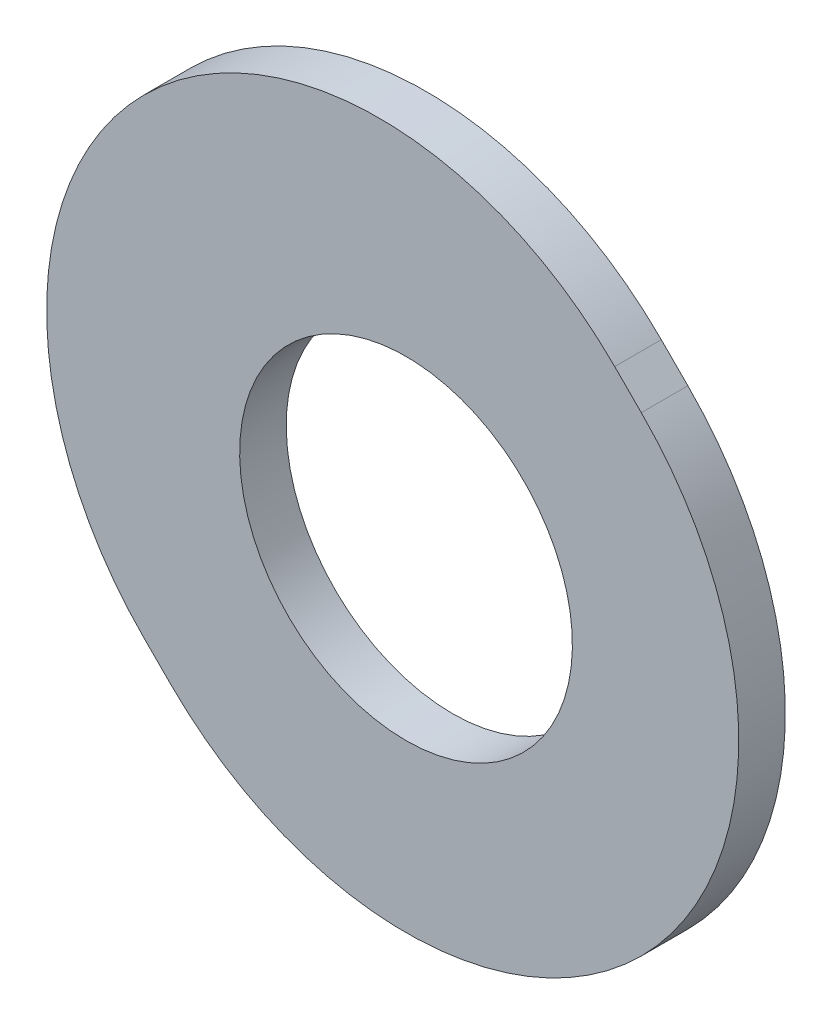
ISO-10303-21;
HEADER;
FILE_DESCRIPTION(('STEP AP214'),'2;1');
FILE_NAME('part.step','',(''),(''),'','','');
FILE_SCHEMA(('AUTOMOTIVE_DESIGN { 1 0 10303 214 1 1 1 1 }'));
ENDSEC;
DATA;
#1=APPLICATION_CONTEXT('core data for automotive mechanical design processes');
#2=APPLICATION_PROTOCOL_DEFINITION('international standard','automotive_design',2000,#1);
#3=PRODUCT_CONTEXT('',#1,'mechanical');
#4=PRODUCT('Part','Part','',(#3));
#5=PRODUCT_RELATED_PRODUCT_CATEGORY('part','',(#4));
#6=PRODUCT_DEFINITION_FORMATION('','',#4);
#7=PRODUCT_DEFINITION_CONTEXT('part definition',#1,'design');
#8=PRODUCT_DEFINITION('design','',#6,#7);
#9=PRODUCT_DEFINITION_SHAPE('','',#8);
#10=(LENGTH_UNIT() NAMED_UNIT(*) SI_UNIT(.MILLI.,.METRE.));
#11=(NAMED_UNIT(*) PLANE_ANGLE_UNIT() SI_UNIT($,.RADIAN.));
#12=(NAMED_UNIT(*) SI_UNIT($,.STERADIAN.) SOLID_ANGLE_UNIT());
#13=UNCERTAINTY_MEASURE_WITH_UNIT(LENGTH_MEASURE(1.E-05),#10,'distance_accuracy_value','');
#14=(GEOMETRIC_REPRESENTATION_CONTEXT(3) GLOBAL_UNCERTAINTY_ASSIGNED_CONTEXT((#13)) GLOBAL_UNIT_ASSIGNED_CONTEXT((#10,
#11,#12)) REPRESENTATION_CONTEXT('',''));
#15=CARTESIAN_POINT('',(0.,0.,0.));
#16=DIRECTION('',(0.,0.,1.));
#17=DIRECTION('',(1.,0.,0.));
#18=AXIS2_PLACEMENT_3D('',#15,#16,#17);
#19=CARTESIAN_POINT('',(102.3,-70.52,-0.045));
#20=DIRECTION('',(0.,0.,-1.));
#21=DIRECTION('',(0.,-1.,0.));
#22=AXIS2_PLACEMENT_3D('',#19,#20,#21);
#23=CYLINDRICAL_SURFACE('',#22,0.125);
#24=CARTESIAN_POINT('',(102.3,-70.52,1.6));
#25=DIRECTION('',(0.,0.,-1.));
#26=DIRECTION('',(0.,-1.,0.));
#27=AXIS2_PLACEMENT_3D('',#24,#25,#26);
#28=CIRCLE('',#27,0.125);
#29=CARTESIAN_POINT('',(102.3,-70.645,1.6));
#30=VERTEX_POINT('',#29);
#31=EDGE_CURVE('E127',#30,#30,#28,.T.);
#32=ORIENTED_EDGE('',*,*,#31,.T.);
#33=DIRECTION('',(0.,0.,1.));
#34=VECTOR('',#33,1.);
#35=CARTESIAN_POINT('',(102.3,-70.645,-0.045));
#36=LINE('',#35,#34);
#37=CARTESIAN_POINT('',(102.3,-70.645,1.635));
#38=VERTEX_POINT('',#37);
#39=EDGE_CURVE('E11',#30,#38,#36,.T.);
#40=ORIENTED_EDGE('',*,*,#39,.T.);
#41=CARTESIAN_POINT('',(102.3,-70.52,1.635));
#42=DIRECTION('',(0.,0.,-1.));
#43=DIRECTION('',(0.,-1.,0.));
#44=AXIS2_PLACEMENT_3D('',#41,#42,#43);
#45=CIRCLE('',#44,0.125);
#46=EDGE_CURVE('E20',#38,#38,#45,.T.);
#47=ORIENTED_EDGE('',*,*,#46,.F.);
#48=ORIENTED_EDGE('',*,*,#39,.F.);
#49=EDGE_LOOP('',(#32,#40,#47,#48));
#50=FACE_BOUND('',#49,.T.);
#51=ADVANCED_FACE('F17',(#50),#23,.F.);
#52=CARTESIAN_POINT('',(102.476776,-70.343223,1.6));
#53=DIRECTION('',(-0.707106781186548,-0.707106781186548,0.));
#54=DIRECTION('',(-0.707106781186548,0.707106781186548,0.));
#55=AXIS2_PLACEMENT_3D('',#52,#53,#54);
#56=PLANE('',#55);
#57=DIRECTION('',(-0.707106781186548,0.707106781186548,0.));
#58=VECTOR('',#57,1.);
#59=CARTESIAN_POINT('',(102.476776,-70.343223,1.6));
#60=LINE('',#59,#58);
#61=CARTESIAN_POINT('',(102.476776,-70.343223,1.6));
#62=VERTEX_POINT('',#61);
#63=CARTESIAN_POINT('',(102.456776,-70.323223,1.6));
#64=VERTEX_POINT('',#63);
#65=EDGE_CURVE('E88',#62,#64,#60,.T.);
#66=ORIENTED_EDGE('',*,*,#65,.T.);
#67=DIRECTION('',(0.,0.,1.));
#68=VECTOR('',#67,1.);
#69=CARTESIAN_POINT('',(102.456776,-70.323223,1.6));
#70=LINE('',#69,#68);
#71=CARTESIAN_POINT('',(102.456776,-70.323223,1.635));
#72=VERTEX_POINT('',#71);
#73=EDGE_CURVE('E112',#64,#72,#70,.T.);
#74=ORIENTED_EDGE('',*,*,#73,.T.);
#75=DIRECTION('',(-0.707106781186548,0.707106781186548,0.));
#76=VECTOR('',#75,1.);
#77=CARTESIAN_POINT('',(102.476776,-70.343223,1.635));
#78=LINE('',#77,#76);
#79=CARTESIAN_POINT('',(102.476776,-70.343223,1.635));
#80=VERTEX_POINT('',#79);
#81=EDGE_CURVE('E124',#80,#72,#78,.T.);
#82=ORIENTED_EDGE('',*,*,#81,.F.);
#83=DIRECTION('',(0.,0.,1.));
#84=VECTOR('',#83,1.);
#85=CARTESIAN_POINT('',(102.476776,-70.343223,1.6));
#86=LINE('',#85,#84);
#87=EDGE_CURVE('E85',#62,#80,#86,.T.);
#88=ORIENTED_EDGE('',*,*,#87,.F.);
#89=EDGE_LOOP('',(#66,#74,#82,#88));
#90=FACE_BOUND('',#89,.T.);
#91=ADVANCED_FACE('F220',(#90),#56,.F.);
#92=CARTESIAN_POINT('',(102.103223,-70.676776,1.635));
#93=DIRECTION('',(0.,0.,1.));
#94=DIRECTION('',(1.,0.,0.));
#95=AXIS2_PLACEMENT_3D('',#92,#93,#94);
#96=PLANE('',#95);
#97=ORIENTED_EDGE('',*,*,#46,.T.);
#98=EDGE_LOOP('',(#97));
#99=FACE_BOUND('',#98,.T.);
#100=DIRECTION('',(0.707106781186548,-0.707106781186548,0.));
#101=VECTOR('',#100,1.);
#102=CARTESIAN_POINT('',(102.103223,-70.676776,1.635));
#103=LINE('',#102,#101);
#104=CARTESIAN_POINT('',(102.103223,-70.676776,1.635));
#105=VERTEX_POINT('',#104);
#106=CARTESIAN_POINT('',(102.123223,-70.696776,1.635));
#107=VERTEX_POINT('',#106);
#108=EDGE_CURVE('E91',#105,#107,#103,.T.);
#109=ORIENTED_EDGE('',*,*,#108,.T.);
#110=CARTESIAN_POINT('',(102.2999995,-70.5199995,1.635));
#111=DIRECTION('',(0.,0.,1.));
#112=DIRECTION('',(-0.707106781186548,-0.707106781186548,0.));
#113=AXIS2_PLACEMENT_3D('',#110,#111,#112);
#114=CIRCLE('',#113,0.249999723809);
#115=EDGE_CURVE('E77',#107,#80,#114,.T.);
#116=ORIENTED_EDGE('',*,*,#115,.T.);
#117=ORIENTED_EDGE('',*,*,#81,.T.);
#118=CARTESIAN_POINT('',(102.2799995,-70.4999995,1.635));
#119=DIRECTION('',(0.,0.,1.));
#120=DIRECTION('',(0.707106781186548,0.707106781186548,0.));
#121=AXIS2_PLACEMENT_3D('',#118,#119,#120);
#122=CIRCLE('',#121,0.249999723809);
#123=EDGE_CURVE('E94',#72,#105,#122,.T.);
#124=ORIENTED_EDGE('',*,*,#123,.T.);
#125=EDGE_LOOP('',(#109,#116,#117,#124));
#126=FACE_BOUND('',#125,.T.);
#127=ADVANCED_FACE('F92',(#99,#126),#96,.T.);
#128=CARTESIAN_POINT('',(102.103223,-70.676776,1.6));
#129=DIRECTION('',(0.,0.,1.));
#130=DIRECTION('',(1.,0.,0.));
#131=AXIS2_PLACEMENT_3D('',#128,#129,#130);
#132=PLANE('',#131);
#133=ORIENTED_EDGE('',*,*,#31,.F.);
#134=EDGE_LOOP('',(#133));
#135=FACE_BOUND('',#134,.T.);
#136=CARTESIAN_POINT('',(102.2799995,-70.4999995,1.6));
#137=DIRECTION('',(0.,0.,1.));
#138=DIRECTION('',(0.707106781186548,0.707106781186548,0.));
#139=AXIS2_PLACEMENT_3D('',#136,#137,#138);
#140=CIRCLE('',#139,0.249999723809);
#141=CARTESIAN_POINT('',(102.103223,-70.676776,1.6));
#142=VERTEX_POINT('',#141);
#143=EDGE_CURVE('E116',#64,#142,#140,.T.);
#144=ORIENTED_EDGE('',*,*,#143,.F.);
#145=ORIENTED_EDGE('',*,*,#65,.F.);
#146=CARTESIAN_POINT('',(102.2999995,-70.5199995,1.6));
#147=DIRECTION('',(0.,0.,1.));
#148=DIRECTION('',(-0.707106781186548,-0.707106781186548,0.));
#149=AXIS2_PLACEMENT_3D('',#146,#147,#148);
#150=CIRCLE('',#149,0.249999723809);
#151=CARTESIAN_POINT('',(102.123223,-70.696776,1.6));
#152=VERTEX_POINT('',#151);
#153=EDGE_CURVE('E119',#152,#62,#150,.T.);
#154=ORIENTED_EDGE('',*,*,#153,.F.);
#155=DIRECTION('',(0.707106781186548,-0.707106781186548,0.));
#156=VECTOR('',#155,1.);
#157=CARTESIAN_POINT('',(102.103223,-70.676776,1.6));
#158=LINE('',#157,#156);
#159=EDGE_CURVE('E103',#142,#152,#158,.T.);
#160=ORIENTED_EDGE('',*,*,#159,.F.);
#161=EDGE_LOOP('',(#144,#145,#154,#160));
#162=FACE_BOUND('',#161,.T.);
#163=ADVANCED_FACE('F136',(#135,#162),#132,.F.);
#164=CARTESIAN_POINT('',(102.2999995,-70.5199995,1.6));
#165=DIRECTION('',(0.,0.,-1.));
#166=DIRECTION('',(-0.707106781186548,-0.707106781186548,0.));
#167=AXIS2_PLACEMENT_3D('',#164,#165,#166);
#168=CYLINDRICAL_SURFACE('',#167,0.249999723809);
#169=ORIENTED_EDGE('',*,*,#153,.T.);
#170=ORIENTED_EDGE('',*,*,#87,.T.);
#171=ORIENTED_EDGE('',*,*,#115,.F.);
#172=DIRECTION('',(0.,0.,1.));
#173=VECTOR('',#172,1.);
#174=CARTESIAN_POINT('',(102.123223,-70.696776,1.6));
#175=LINE('',#174,#173);
#176=EDGE_CURVE('E82',#152,#107,#175,.T.);
#177=ORIENTED_EDGE('',*,*,#176,.F.);
#178=EDGE_LOOP('',(#169,#170,#171,#177));
#179=FACE_BOUND('',#178,.T.);
#180=ADVANCED_FACE('F80',(#179),#168,.T.);
#181=CARTESIAN_POINT('',(102.2799995,-70.4999995,1.6));
#182=DIRECTION('',(0.,0.,-1.));
#183=DIRECTION('',(0.707106781186548,0.707106781186548,0.));
#184=AXIS2_PLACEMENT_3D('',#181,#182,#183);
#185=CYLINDRICAL_SURFACE('',#184,0.249999723809);
#186=ORIENTED_EDGE('',*,*,#143,.T.);
#187=DIRECTION('',(0.,0.,1.));
#188=VECTOR('',#187,1.);
#189=CARTESIAN_POINT('',(102.103223,-70.676776,1.6));
#190=LINE('',#189,#188);
#191=EDGE_CURVE('E99',#142,#105,#190,.T.);
#192=ORIENTED_EDGE('',*,*,#191,.T.);
#193=ORIENTED_EDGE('',*,*,#123,.F.);
#194=ORIENTED_EDGE('',*,*,#73,.F.);
#195=EDGE_LOOP('',(#186,#192,#193,#194));
#196=FACE_BOUND('',#195,.T.);
#197=ADVANCED_FACE('F143',(#196),#185,.T.);
#198=CARTESIAN_POINT('',(102.103223,-70.676776,1.6));
#199=DIRECTION('',(0.707106781186548,0.707106781186548,0.));
#200=DIRECTION('',(0.,0.,-1.));
#201=AXIS2_PLACEMENT_3D('',#198,#199,#200);
#202=PLANE('',#201);
#203=ORIENTED_EDGE('',*,*,#159,.T.);
#204=ORIENTED_EDGE('',*,*,#176,.T.);
#205=ORIENTED_EDGE('',*,*,#108,.F.);
#206=ORIENTED_EDGE('',*,*,#191,.F.);
#207=EDGE_LOOP('',(#203,#204,#205,#206));
#208=FACE_BOUND('',#207,.T.);
#209=ADVANCED_FACE('F101',(#208),#202,.F.);
#210=CLOSED_SHELL('',(#51,#91,#127,#163,#180,#197,#209));
#211=MANIFOLD_SOLID_BREP('B1',#210);
#212=ADVANCED_BREP_SHAPE_REPRESENTATION('',(#18,#211),#14);
#213=SHAPE_DEFINITION_REPRESENTATION(#9,#212);
ENDSEC;
END-ISO-10303-21;
